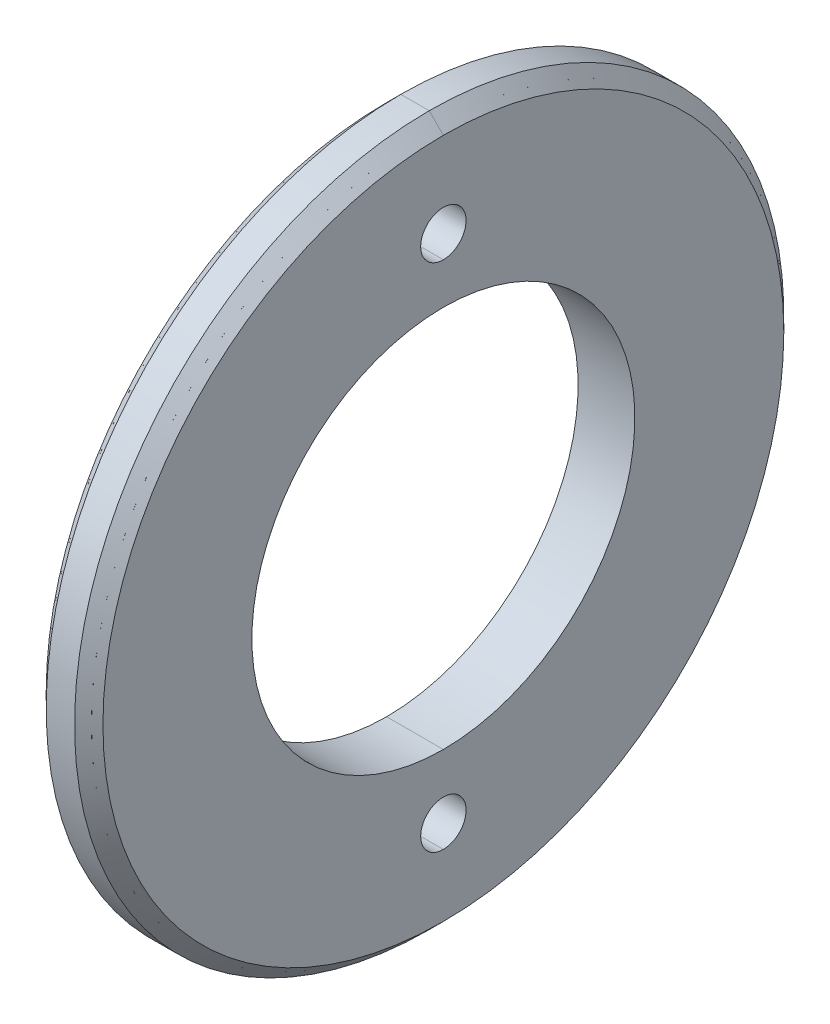
ISO-10303-21;
HEADER;
FILE_DESCRIPTION(('STEP AP214'),'2;1');
FILE_NAME('part.step','',(''),(''),'','','');
FILE_SCHEMA(('AUTOMOTIVE_DESIGN { 1 0 10303 214 1 1 1 1 }'));
ENDSEC;
DATA;
#1=APPLICATION_CONTEXT('core data for automotive mechanical design processes');
#2=APPLICATION_PROTOCOL_DEFINITION('international standard','automotive_design',2000,#1);
#3=PRODUCT_CONTEXT('',#1,'mechanical');
#4=PRODUCT('Part','Part','',(#3));
#5=PRODUCT_RELATED_PRODUCT_CATEGORY('part','',(#4));
#6=PRODUCT_DEFINITION_FORMATION('','',#4);
#7=PRODUCT_DEFINITION_CONTEXT('part definition',#1,'design');
#8=PRODUCT_DEFINITION('design','',#6,#7);
#9=PRODUCT_DEFINITION_SHAPE('','',#8);
#10=(LENGTH_UNIT() NAMED_UNIT(*) SI_UNIT(.MILLI.,.METRE.));
#11=(NAMED_UNIT(*) PLANE_ANGLE_UNIT() SI_UNIT($,.RADIAN.));
#12=(NAMED_UNIT(*) SI_UNIT($,.STERADIAN.) SOLID_ANGLE_UNIT());
#13=UNCERTAINTY_MEASURE_WITH_UNIT(LENGTH_MEASURE(1.E-05),#10,'distance_accuracy_value','');
#14=(GEOMETRIC_REPRESENTATION_CONTEXT(3) GLOBAL_UNCERTAINTY_ASSIGNED_CONTEXT((#13)) GLOBAL_UNIT_ASSIGNED_CONTEXT((#10,
#11,#12)) REPRESENTATION_CONTEXT('',''));
#15=CARTESIAN_POINT('',(0.,0.,0.));
#16=DIRECTION('',(0.,0.,1.));
#17=DIRECTION('',(1.,0.,0.));
#18=AXIS2_PLACEMENT_3D('',#15,#16,#17);
#19=CARTESIAN_POINT('',(-0.2,0.,0.));
#20=DIRECTION('',(1.,0.,0.));
#21=DIRECTION('',(0.,1.,0.));
#22=AXIS2_PLACEMENT_3D('',#19,#20,#21);
#23=CYLINDRICAL_SURFACE('',#22,12.2);
#24=CARTESIAN_POINT('',(1.8,12.2,0.));
#25=DIRECTION('',(-1.,0.,0.));
#26=VECTOR('',#25,1.);
#27=LINE('',#24,#26);
#28=CARTESIAN_POINT('',(1.8,12.2,0.));
#29=VERTEX_POINT('',#28);
#30=CARTESIAN_POINT('',(0.2,12.2,0.));
#31=VERTEX_POINT('',#30);
#32=EDGE_CURVE('P0_E27',#29,#31,#27,.T.);
#33=ORIENTED_EDGE('',*,*,#32,.T.);
#34=CARTESIAN_POINT('',(0.2,0.,0.));
#35=DIRECTION('',(1.,0.,0.));
#36=DIRECTION('',(0.,1.,0.));
#37=AXIS2_PLACEMENT_3D('',#34,#35,#36);
#38=CIRCLE('',#37,12.2);
#39=CARTESIAN_POINT('',(0.2,-12.2,0.));
#40=VERTEX_POINT('',#39);
#41=EDGE_CURVE('P0_E11',#31,#40,#38,.T.);
#42=ORIENTED_EDGE('',*,*,#41,.T.);
#43=CARTESIAN_POINT('',(0.2,-12.2,0.));
#44=DIRECTION('',(1.,0.,0.));
#45=VECTOR('',#44,1.);
#46=LINE('',#43,#45);
#47=CARTESIAN_POINT('',(1.8,-12.2,0.));
#48=VERTEX_POINT('',#47);
#49=EDGE_CURVE('P0_E44',#40,#48,#46,.T.);
#50=ORIENTED_EDGE('',*,*,#49,.T.);
#51=CARTESIAN_POINT('',(1.8,0.,0.));
#52=DIRECTION('',(-1.,0.,0.));
#53=DIRECTION('',(0.,-1.,0.));
#54=AXIS2_PLACEMENT_3D('',#51,#52,#53);
#55=CIRCLE('',#54,12.2);
#56=EDGE_CURVE('P0_E51',#48,#29,#55,.T.);
#57=ORIENTED_EDGE('',*,*,#56,.T.);
#58=EDGE_LOOP('',(#33,#42,#50,#57));
#59=FACE_BOUND('',#58,.T.);
#60=ADVANCED_FACE('P0_F16',(#59),#23,.T.);
#61=CARTESIAN_POINT('',(-0.2,0.,0.));
#62=DIRECTION('',(1.,0.,0.));
#63=DIRECTION('',(0.,1.,0.));
#64=AXIS2_PLACEMENT_3D('',#61,#62,#63);
#65=CYLINDRICAL_SURFACE('',#64,12.2);
#66=ORIENTED_EDGE('',*,*,#49,.F.);
#67=CARTESIAN_POINT('',(0.2,0.,0.));
#68=DIRECTION('',(1.,0.,0.));
#69=DIRECTION('',(0.,-1.,0.));
#70=AXIS2_PLACEMENT_3D('',#67,#68,#69);
#71=CIRCLE('',#70,12.2);
#72=EDGE_CURVE('P0_E35',#40,#31,#71,.T.);
#73=ORIENTED_EDGE('',*,*,#72,.T.);
#74=ORIENTED_EDGE('',*,*,#32,.F.);
#75=CARTESIAN_POINT('',(1.8,0.,0.));
#76=DIRECTION('',(-1.,0.,0.));
#77=DIRECTION('',(0.,1.,0.));
#78=AXIS2_PLACEMENT_3D('',#75,#76,#77);
#79=CIRCLE('',#78,12.2);
#80=EDGE_CURVE('P0_E41',#29,#48,#79,.T.);
#81=ORIENTED_EDGE('',*,*,#80,.T.);
#82=EDGE_LOOP('',(#66,#73,#74,#81));
#83=FACE_BOUND('',#82,.T.);
#84=ADVANCED_FACE('P0_F17',(#83),#65,.T.);
#85=OPEN_SHELL('',(#60,#84));
#86=SHELL_BASED_SURFACE_MODEL('P0_B1',(#85));
#87=CARTESIAN_POINT('',(1.75,0.,0.));
#88=DIRECTION('',(-1.,0.,0.));
#89=DIRECTION('',(0.,1.,0.));
#90=AXIS2_PLACEMENT_3D('',#87,#88,#89);
#91=CONICAL_SURFACE('',#90,12.25,0.7853981633973);
#92=DIRECTION('',(0.707106781186548,-0.707106781186548,0.));
#93=VECTOR('',#92,1.);
#94=CARTESIAN_POINT('',(1.5,12.5,0.));
#95=LINE('',#94,#93);
#96=CARTESIAN_POINT('',(1.5,12.5,0.));
#97=VERTEX_POINT('',#96);
#98=CARTESIAN_POINT('',(2.,12.,0.));
#99=VERTEX_POINT('',#98);
#100=EDGE_CURVE('P1_E146',#97,#99,#95,.T.);
#101=ORIENTED_EDGE('',*,*,#100,.T.);
#102=CARTESIAN_POINT('',(2.,0.,0.));
#103=DIRECTION('',(-1.,0.,0.));
#104=DIRECTION('',(0.,1.,0.));
#105=AXIS2_PLACEMENT_3D('',#102,#103,#104);
#106=CIRCLE('',#105,12.);
#107=CARTESIAN_POINT('',(2.,-12.,0.));
#108=VERTEX_POINT('',#107);
#109=EDGE_CURVE('P1_E75',#99,#108,#106,.T.);
#110=ORIENTED_EDGE('',*,*,#109,.T.);
#111=DIRECTION('',(0.707106781186548,0.707106781186548,0.));
#112=VECTOR('',#111,1.);
#113=CARTESIAN_POINT('',(1.5,-12.5,0.));
#114=LINE('',#113,#112);
#115=CARTESIAN_POINT('',(1.5,-12.5,0.));
#116=VERTEX_POINT('',#115);
#117=EDGE_CURVE('P1_E136',#116,#108,#114,.T.);
#118=ORIENTED_EDGE('',*,*,#117,.F.);
#119=CARTESIAN_POINT('',(1.5,0.,0.));
#120=DIRECTION('',(-1.,0.,0.));
#121=DIRECTION('',(0.,1.,0.));
#122=AXIS2_PLACEMENT_3D('',#119,#120,#121);
#123=CIRCLE('',#122,12.5);
#124=EDGE_CURVE('P1_E105',#97,#116,#123,.T.);
#125=ORIENTED_EDGE('',*,*,#124,.F.);
#126=EDGE_LOOP('',(#101,#110,#118,#125));
#127=FACE_BOUND('',#126,.T.);
#128=ADVANCED_FACE('P1_F16',(#127),#91,.T.);
#129=CARTESIAN_POINT('',(0.,-9.,0.));
#130=DIRECTION('',(-1.,0.,0.));
#131=DIRECTION('',(0.,-1.,0.));
#132=AXIS2_PLACEMENT_3D('',#129,#130,#131);
#133=CYLINDRICAL_SURFACE('',#132,0.8);
#134=DIRECTION('',(1.,0.,0.));
#135=VECTOR('',#134,1.);
#136=CARTESIAN_POINT('',(0.,-8.2,0.));
#137=LINE('',#136,#135);
#138=CARTESIAN_POINT('',(0.,-8.2,0.));
#139=VERTEX_POINT('',#138);
#140=CARTESIAN_POINT('',(2.,-8.2,0.));
#141=VERTEX_POINT('',#140);
#142=EDGE_CURVE('P1_E11',#139,#141,#137,.T.);
#143=ORIENTED_EDGE('',*,*,#142,.F.);
#144=CARTESIAN_POINT('',(0.,-9.,0.));
#145=DIRECTION('',(-1.,0.,0.));
#146=DIRECTION('',(0.,1.,0.));
#147=AXIS2_PLACEMENT_3D('',#144,#145,#146);
#148=CIRCLE('',#147,0.8);
#149=CARTESIAN_POINT('',(0.,-9.8,0.));
#150=VERTEX_POINT('',#149);
#151=EDGE_CURVE('P1_E140',#139,#150,#148,.T.);
#152=ORIENTED_EDGE('',*,*,#151,.T.);
#153=DIRECTION('',(1.,0.,0.));
#154=VECTOR('',#153,1.);
#155=CARTESIAN_POINT('',(0.,-9.8,0.));
#156=LINE('',#155,#154);
#157=CARTESIAN_POINT('',(2.,-9.8,0.));
#158=VERTEX_POINT('',#157);
#159=EDGE_CURVE('P1_E27',#150,#158,#156,.T.);
#160=ORIENTED_EDGE('',*,*,#159,.T.);
#161=CARTESIAN_POINT('',(2.,-9.,0.));
#162=DIRECTION('',(-1.,0.,0.));
#163=DIRECTION('',(0.,1.,0.));
#164=AXIS2_PLACEMENT_3D('',#161,#162,#163);
#165=CIRCLE('',#164,0.8);
#166=EDGE_CURVE('P1_E137',#141,#158,#165,.T.);
#167=ORIENTED_EDGE('',*,*,#166,.F.);
#168=EDGE_LOOP('',(#143,#152,#160,#167));
#169=FACE_BOUND('',#168,.T.);
#170=ADVANCED_FACE('P1_F229',(#169),#133,.F.);
#171=CARTESIAN_POINT('',(0.,-9.,0.));
#172=DIRECTION('',(-1.,0.,0.));
#173=DIRECTION('',(0.,-1.,0.));
#174=AXIS2_PLACEMENT_3D('',#171,#172,#173);
#175=CYLINDRICAL_SURFACE('',#174,0.8);
#176=ORIENTED_EDGE('',*,*,#159,.F.);
#177=CARTESIAN_POINT('',(0.,-9.,0.));
#178=DIRECTION('',(-1.,0.,0.));
#179=DIRECTION('',(0.,-1.,0.));
#180=AXIS2_PLACEMENT_3D('',#177,#178,#179);
#181=CIRCLE('',#180,0.8);
#182=EDGE_CURVE('P1_E123',#150,#139,#181,.T.);
#183=ORIENTED_EDGE('',*,*,#182,.T.);
#184=ORIENTED_EDGE('',*,*,#142,.T.);
#185=CARTESIAN_POINT('',(2.,-9.,0.));
#186=DIRECTION('',(-1.,0.,0.));
#187=DIRECTION('',(0.,-1.,0.));
#188=AXIS2_PLACEMENT_3D('',#185,#186,#187);
#189=CIRCLE('',#188,0.8);
#190=EDGE_CURVE('P1_E132',#158,#141,#189,.T.);
#191=ORIENTED_EDGE('',*,*,#190,.F.);
#192=EDGE_LOOP('',(#176,#183,#184,#191));
#193=FACE_BOUND('',#192,.T.);
#194=ADVANCED_FACE('P1_F233',(#193),#175,.F.);
#195=CARTESIAN_POINT('',(0.,9.,0.));
#196=DIRECTION('',(1.,0.,0.));
#197=DIRECTION('',(0.,1.,0.));
#198=AXIS2_PLACEMENT_3D('',#195,#196,#197);
#199=CYLINDRICAL_SURFACE('',#198,0.8);
#200=DIRECTION('',(1.,0.,0.));
#201=VECTOR('',#200,1.);
#202=CARTESIAN_POINT('',(0.,9.8,0.));
#203=LINE('',#202,#201);
#204=CARTESIAN_POINT('',(0.,9.8,0.));
#205=VERTEX_POINT('',#204);
#206=CARTESIAN_POINT('',(2.,9.8,0.));
#207=VERTEX_POINT('',#206);
#208=EDGE_CURVE('P1_E122',#205,#207,#203,.T.);
#209=ORIENTED_EDGE('',*,*,#208,.F.);
#210=CARTESIAN_POINT('',(0.,9.,0.));
#211=DIRECTION('',(1.,0.,0.));
#212=DIRECTION('',(0.,-1.,0.));
#213=AXIS2_PLACEMENT_3D('',#210,#211,#212);
#214=CIRCLE('',#213,0.8);
#215=CARTESIAN_POINT('',(0.,8.2,0.));
#216=VERTEX_POINT('',#215);
#217=EDGE_CURVE('P1_E111',#216,#205,#214,.T.);
#218=ORIENTED_EDGE('',*,*,#217,.F.);
#219=DIRECTION('',(1.,0.,0.));
#220=VECTOR('',#219,1.);
#221=CARTESIAN_POINT('',(0.,8.2,0.));
#222=LINE('',#221,#220);
#223=CARTESIAN_POINT('',(2.,8.2,0.));
#224=VERTEX_POINT('',#223);
#225=EDGE_CURVE('P1_E118',#216,#224,#222,.T.);
#226=ORIENTED_EDGE('',*,*,#225,.T.);
#227=CARTESIAN_POINT('',(2.,9.,0.));
#228=DIRECTION('',(1.,0.,0.));
#229=DIRECTION('',(0.,-1.,0.));
#230=AXIS2_PLACEMENT_3D('',#227,#228,#229);
#231=CIRCLE('',#230,0.8);
#232=EDGE_CURVE('P1_E126',#224,#207,#231,.T.);
#233=ORIENTED_EDGE('',*,*,#232,.T.);
#234=EDGE_LOOP('',(#209,#218,#226,#233));
#235=FACE_BOUND('',#234,.T.);
#236=ADVANCED_FACE('P1_F239',(#235),#199,.F.);
#237=CARTESIAN_POINT('',(0.,9.,0.));
#238=DIRECTION('',(1.,0.,0.));
#239=DIRECTION('',(0.,1.,0.));
#240=AXIS2_PLACEMENT_3D('',#237,#238,#239);
#241=CYLINDRICAL_SURFACE('',#240,0.8);
#242=ORIENTED_EDGE('',*,*,#225,.F.);
#243=CARTESIAN_POINT('',(0.,9.,0.));
#244=DIRECTION('',(1.,0.,0.));
#245=DIRECTION('',(0.,1.,0.));
#246=AXIS2_PLACEMENT_3D('',#243,#244,#245);
#247=CIRCLE('',#246,0.8);
#248=EDGE_CURVE('P1_E115',#205,#216,#247,.T.);
#249=ORIENTED_EDGE('',*,*,#248,.F.);
#250=ORIENTED_EDGE('',*,*,#208,.T.);
#251=CARTESIAN_POINT('',(2.,9.,0.));
#252=DIRECTION('',(1.,0.,0.));
#253=DIRECTION('',(0.,1.,0.));
#254=AXIS2_PLACEMENT_3D('',#251,#252,#253);
#255=CIRCLE('',#254,0.8);
#256=EDGE_CURVE('P1_E130',#207,#224,#255,.T.);
#257=ORIENTED_EDGE('',*,*,#256,.T.);
#258=EDGE_LOOP('',(#242,#249,#250,#257));
#259=FACE_BOUND('',#258,.T.);
#260=ADVANCED_FACE('P1_F242',(#259),#241,.F.);
#261=CARTESIAN_POINT('',(0.25,0.,0.));
#262=DIRECTION('',(1.,0.,0.));
#263=DIRECTION('',(0.,-1.,0.));
#264=AXIS2_PLACEMENT_3D('',#261,#262,#263);
#265=CONICAL_SURFACE('',#264,12.25,0.7853981633973);
#266=DIRECTION('',(0.707106781186548,-0.707106781186548,0.));
#267=VECTOR('',#266,1.);
#268=CARTESIAN_POINT('',(0.,-12.,0.));
#269=LINE('',#268,#267);
#270=CARTESIAN_POINT('',(0.,-12.,0.));
#271=VERTEX_POINT('',#270);
#272=CARTESIAN_POINT('',(0.5,-12.5,0.));
#273=VERTEX_POINT('',#272);
#274=EDGE_CURVE('P1_E153',#271,#273,#269,.T.);
#275=ORIENTED_EDGE('',*,*,#274,.T.);
#276=CARTESIAN_POINT('',(0.5,0.,0.));
#277=DIRECTION('',(1.,0.,0.));
#278=DIRECTION('',(0.,1.,0.));
#279=AXIS2_PLACEMENT_3D('',#276,#277,#278);
#280=CIRCLE('',#279,12.5);
#281=CARTESIAN_POINT('',(0.5,12.5,0.));
#282=VERTEX_POINT('',#281);
#283=EDGE_CURVE('P1_E145',#282,#273,#280,.T.);
#284=ORIENTED_EDGE('',*,*,#283,.F.);
#285=DIRECTION('',(0.707106781186548,0.707106781186548,0.));
#286=VECTOR('',#285,1.);
#287=CARTESIAN_POINT('',(0.,12.,0.));
#288=LINE('',#287,#286);
#289=CARTESIAN_POINT('',(0.,12.,0.));
#290=VERTEX_POINT('',#289);
#291=EDGE_CURVE('P1_E98',#290,#282,#288,.T.);
#292=ORIENTED_EDGE('',*,*,#291,.F.);
#293=CARTESIAN_POINT('',(0.,0.,0.));
#294=DIRECTION('',(1.,0.,0.));
#295=DIRECTION('',(0.,1.,0.));
#296=AXIS2_PLACEMENT_3D('',#293,#294,#295);
#297=CIRCLE('',#296,12.);
#298=EDGE_CURVE('P1_E20',#290,#271,#297,.T.);
#299=ORIENTED_EDGE('',*,*,#298,.T.);
#300=EDGE_LOOP('',(#275,#284,#292,#299));
#301=FACE_BOUND('',#300,.T.);
#302=ADVANCED_FACE('P1_F246',(#301),#265,.T.);
#303=CARTESIAN_POINT('',(0.,0.,0.));
#304=DIRECTION('',(1.,0.,0.));
#305=DIRECTION('',(0.,1.,0.));
#306=AXIS2_PLACEMENT_3D('',#303,#304,#305);
#307=PLANE('',#306);
#308=ORIENTED_EDGE('',*,*,#151,.F.);
#309=ORIENTED_EDGE('',*,*,#182,.F.);
#310=EDGE_LOOP('',(#308,#309));
#311=FACE_BOUND('',#310,.T.);
#312=ORIENTED_EDGE('',*,*,#217,.T.);
#313=ORIENTED_EDGE('',*,*,#248,.T.);
#314=EDGE_LOOP('',(#312,#313));
#315=FACE_BOUND('',#314,.T.);
#316=CARTESIAN_POINT('',(0.,0.,0.));
#317=DIRECTION('',(-1.,0.,0.));
#318=DIRECTION('',(0.,1.,0.));
#319=AXIS2_PLACEMENT_3D('',#316,#317,#318);
#320=CIRCLE('',#319,6.75);
#321=CARTESIAN_POINT('',(0.,6.75,0.));
#322=VERTEX_POINT('',#321);
#323=CARTESIAN_POINT('',(0.,-6.75,0.));
#324=VERTEX_POINT('',#323);
#325=EDGE_CURVE('P1_E76',#322,#324,#320,.T.);
#326=ORIENTED_EDGE('',*,*,#325,.F.);
#327=CARTESIAN_POINT('',(0.,0.,0.));
#328=DIRECTION('',(1.,0.,0.));
#329=DIRECTION('',(0.,1.,0.));
#330=AXIS2_PLACEMENT_3D('',#327,#328,#329);
#331=CIRCLE('',#330,6.75);
#332=EDGE_CURVE('P1_E82',#322,#324,#331,.T.);
#333=ORIENTED_EDGE('',*,*,#332,.T.);
#334=EDGE_LOOP('',(#326,#333));
#335=FACE_BOUND('',#334,.T.);
#336=ORIENTED_EDGE('',*,*,#298,.F.);
#337=CARTESIAN_POINT('',(0.,0.,0.));
#338=DIRECTION('',(-1.,0.,0.));
#339=DIRECTION('',(0.,1.,0.));
#340=AXIS2_PLACEMENT_3D('',#337,#338,#339);
#341=CIRCLE('',#340,12.);
#342=EDGE_CURVE('P1_E156',#290,#271,#341,.T.);
#343=ORIENTED_EDGE('',*,*,#342,.T.);
#344=EDGE_LOOP('',(#336,#343));
#345=FACE_BOUND('',#344,.T.);
#346=ADVANCED_FACE('P1_F248',(#311,#315,#335,#345),#307,.F.);
#347=CARTESIAN_POINT('',(0.25,0.,0.));
#348=DIRECTION('',(1.,0.,0.));
#349=DIRECTION('',(0.,-1.,0.));
#350=AXIS2_PLACEMENT_3D('',#347,#348,#349);
#351=CONICAL_SURFACE('',#350,12.25,0.7853981633973);
#352=ORIENTED_EDGE('',*,*,#291,.T.);
#353=CARTESIAN_POINT('',(0.5,0.,0.));
#354=DIRECTION('',(-1.,0.,0.));
#355=DIRECTION('',(0.,1.,0.));
#356=AXIS2_PLACEMENT_3D('',#353,#354,#355);
#357=CIRCLE('',#356,12.5);
#358=EDGE_CURVE('P1_E109',#282,#273,#357,.T.);
#359=ORIENTED_EDGE('',*,*,#358,.T.);
#360=ORIENTED_EDGE('',*,*,#274,.F.);
#361=ORIENTED_EDGE('',*,*,#342,.F.);
#362=EDGE_LOOP('',(#352,#359,#360,#361));
#363=FACE_BOUND('',#362,.T.);
#364=ADVANCED_FACE('P1_F18',(#363),#351,.T.);
#365=CARTESIAN_POINT('',(-0.1,0.,0.));
#366=DIRECTION('',(1.,0.,0.));
#367=DIRECTION('',(0.,-1.,0.));
#368=AXIS2_PLACEMENT_3D('',#365,#366,#367);
#369=CYLINDRICAL_SURFACE('',#368,12.5);
#370=ORIENTED_EDGE('',*,*,#124,.T.);
#371=DIRECTION('',(-1.,0.,0.));
#372=VECTOR('',#371,1.);
#373=CARTESIAN_POINT('',(1.5,-12.5,0.));
#374=LINE('',#373,#372);
#375=EDGE_CURVE('P1_E106',#116,#273,#374,.T.);
#376=ORIENTED_EDGE('',*,*,#375,.T.);
#377=ORIENTED_EDGE('',*,*,#358,.F.);
#378=DIRECTION('',(-1.,0.,0.));
#379=VECTOR('',#378,1.);
#380=CARTESIAN_POINT('',(1.5,12.5,0.));
#381=LINE('',#380,#379);
#382=EDGE_CURVE('P1_E101',#97,#282,#381,.T.);
#383=ORIENTED_EDGE('',*,*,#382,.F.);
#384=EDGE_LOOP('',(#370,#376,#377,#383));
#385=FACE_BOUND('',#384,.T.);
#386=ADVANCED_FACE('P1_F256',(#385),#369,.T.);
#387=CARTESIAN_POINT('',(-0.1,0.,0.));
#388=DIRECTION('',(1.,0.,0.));
#389=DIRECTION('',(0.,-1.,0.));
#390=AXIS2_PLACEMENT_3D('',#387,#388,#389);
#391=CYLINDRICAL_SURFACE('',#390,12.5);
#392=ORIENTED_EDGE('',*,*,#283,.T.);
#393=ORIENTED_EDGE('',*,*,#375,.F.);
#394=CARTESIAN_POINT('',(1.5,0.,0.));
#395=DIRECTION('',(1.,0.,0.));
#396=DIRECTION('',(0.,1.,0.));
#397=AXIS2_PLACEMENT_3D('',#394,#395,#396);
#398=CIRCLE('',#397,12.5);
#399=EDGE_CURVE('P1_E141',#97,#116,#398,.T.);
#400=ORIENTED_EDGE('',*,*,#399,.F.);
#401=ORIENTED_EDGE('',*,*,#382,.T.);
#402=EDGE_LOOP('',(#392,#393,#400,#401));
#403=FACE_BOUND('',#402,.T.);
#404=ADVANCED_FACE('P1_F223',(#403),#391,.T.);
#405=CARTESIAN_POINT('',(1.75,0.,0.));
#406=DIRECTION('',(-1.,0.,0.));
#407=DIRECTION('',(0.,1.,0.));
#408=AXIS2_PLACEMENT_3D('',#405,#406,#407);
#409=CONICAL_SURFACE('',#408,12.25,0.7853981633973);
#410=ORIENTED_EDGE('',*,*,#117,.T.);
#411=CARTESIAN_POINT('',(2.,0.,0.));
#412=DIRECTION('',(1.,0.,0.));
#413=DIRECTION('',(0.,1.,0.));
#414=AXIS2_PLACEMENT_3D('',#411,#412,#413);
#415=CIRCLE('',#414,12.);
#416=EDGE_CURVE('P1_E131',#99,#108,#415,.T.);
#417=ORIENTED_EDGE('',*,*,#416,.F.);
#418=ORIENTED_EDGE('',*,*,#100,.F.);
#419=ORIENTED_EDGE('',*,*,#399,.T.);
#420=EDGE_LOOP('',(#410,#417,#418,#419));
#421=FACE_BOUND('',#420,.T.);
#422=ADVANCED_FACE('P1_F213',(#421),#409,.T.);
#423=CARTESIAN_POINT('',(2.,0.,0.));
#424=DIRECTION('',(1.,0.,0.));
#425=DIRECTION('',(0.,1.,0.));
#426=AXIS2_PLACEMENT_3D('',#423,#424,#425);
#427=PLANE('',#426);
#428=ORIENTED_EDGE('',*,*,#166,.T.);
#429=ORIENTED_EDGE('',*,*,#190,.T.);
#430=EDGE_LOOP('',(#428,#429));
#431=FACE_BOUND('',#430,.T.);
#432=ORIENTED_EDGE('',*,*,#232,.F.);
#433=ORIENTED_EDGE('',*,*,#256,.F.);
#434=EDGE_LOOP('',(#432,#433));
#435=FACE_BOUND('',#434,.T.);
#436=CARTESIAN_POINT('',(2.,0.,0.));
#437=DIRECTION('',(1.,0.,0.));
#438=DIRECTION('',(0.,1.,0.));
#439=AXIS2_PLACEMENT_3D('',#436,#437,#438);
#440=CIRCLE('',#439,6.75);
#441=CARTESIAN_POINT('',(2.,6.75,0.));
#442=VERTEX_POINT('',#441);
#443=CARTESIAN_POINT('',(2.,-6.75,0.));
#444=VERTEX_POINT('',#443);
#445=EDGE_CURVE('P1_E80',#442,#444,#440,.T.);
#446=ORIENTED_EDGE('',*,*,#445,.F.);
#447=CARTESIAN_POINT('',(2.,0.,0.));
#448=DIRECTION('',(-1.,0.,0.));
#449=DIRECTION('',(0.,1.,0.));
#450=AXIS2_PLACEMENT_3D('',#447,#448,#449);
#451=CIRCLE('',#450,6.75);
#452=EDGE_CURVE('P1_E57',#442,#444,#451,.T.);
#453=ORIENTED_EDGE('',*,*,#452,.T.);
#454=EDGE_LOOP('',(#446,#453));
#455=FACE_BOUND('',#454,.T.);
#456=ORIENTED_EDGE('',*,*,#109,.F.);
#457=ORIENTED_EDGE('',*,*,#416,.T.);
#458=EDGE_LOOP('',(#456,#457));
#459=FACE_BOUND('',#458,.T.);
#460=ADVANCED_FACE('P1_F85',(#431,#435,#455,#459),#427,.T.);
#461=CARTESIAN_POINT('',(-0.1,0.,0.));
#462=DIRECTION('',(1.,0.,0.));
#463=DIRECTION('',(0.,-1.,0.));
#464=AXIS2_PLACEMENT_3D('',#461,#462,#463);
#465=CYLINDRICAL_SURFACE('',#464,6.75);
#466=ORIENTED_EDGE('',*,*,#325,.T.);
#467=DIRECTION('',(1.,0.,0.));
#468=VECTOR('',#467,1.);
#469=CARTESIAN_POINT('',(0.,-6.75,0.));
#470=LINE('',#469,#468);
#471=EDGE_CURVE('P1_E72',#324,#444,#470,.T.);
#472=ORIENTED_EDGE('',*,*,#471,.T.);
#473=ORIENTED_EDGE('',*,*,#452,.F.);
#474=DIRECTION('',(1.,0.,0.));
#475=VECTOR('',#474,1.);
#476=CARTESIAN_POINT('',(0.,6.75,0.));
#477=LINE('',#476,#475);
#478=EDGE_CURVE('P1_E69',#322,#442,#477,.T.);
#479=ORIENTED_EDGE('',*,*,#478,.F.);
#480=EDGE_LOOP('',(#466,#472,#473,#479));
#481=FACE_BOUND('',#480,.T.);
#482=ADVANCED_FACE('P1_F68',(#481),#465,.F.);
#483=CARTESIAN_POINT('',(-0.1,0.,0.));
#484=DIRECTION('',(1.,0.,0.));
#485=DIRECTION('',(0.,-1.,0.));
#486=AXIS2_PLACEMENT_3D('',#483,#484,#485);
#487=CYLINDRICAL_SURFACE('',#486,6.75);
#488=ORIENTED_EDGE('',*,*,#445,.T.);
#489=ORIENTED_EDGE('',*,*,#471,.F.);
#490=ORIENTED_EDGE('',*,*,#332,.F.);
#491=ORIENTED_EDGE('',*,*,#478,.T.);
#492=EDGE_LOOP('',(#488,#489,#490,#491));
#493=FACE_BOUND('',#492,.T.);
#494=ADVANCED_FACE('P1_F79',(#493),#487,.F.);
#495=CLOSED_SHELL('',(#128,#170,#194,#236,#260,#302,#346,#364,#386,#404,#422,#460,#482,#494));
#496=MANIFOLD_SOLID_BREP('P1_B1',#495);
#497=ADVANCED_BREP_SHAPE_REPRESENTATION('',(#18,#496),#14);
#498=MANIFOLD_SURFACE_SHAPE_REPRESENTATION('',(#18,#86),#14);
#499=SHAPE_REPRESENTATION('',(#18),#14);
#500=SHAPE_DEFINITION_REPRESENTATION(#9,#499);
#501=SHAPE_REPRESENTATION_RELATIONSHIP('','',#499,#497);
#502=SHAPE_REPRESENTATION_RELATIONSHIP('','',#499,#498);
ENDSEC;
END-ISO-10303-21;
